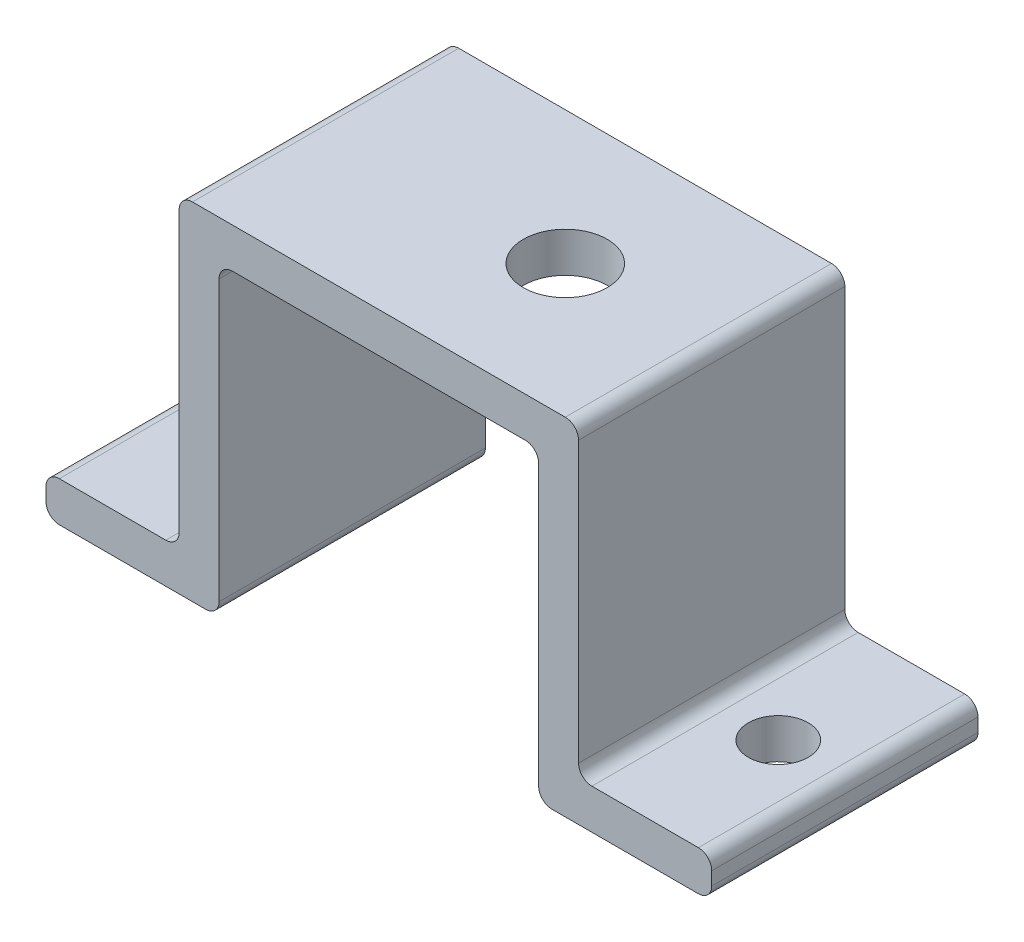
ISO-10303-21;
HEADER;
FILE_DESCRIPTION(('STEP AP214'),'2;1');
FILE_NAME('part.step','',(''),(''),'','','');
FILE_SCHEMA(('AUTOMOTIVE_DESIGN { 1 0 10303 214 1 1 1 1 }'));
ENDSEC;
DATA;
#1=APPLICATION_CONTEXT('core data for automotive mechanical design processes');
#2=APPLICATION_PROTOCOL_DEFINITION('international standard','automotive_design',2000,#1);
#3=PRODUCT_CONTEXT('',#1,'mechanical');
#4=PRODUCT('Part','Part','',(#3));
#5=PRODUCT_RELATED_PRODUCT_CATEGORY('part','',(#4));
#6=PRODUCT_DEFINITION_FORMATION('','',#4);
#7=PRODUCT_DEFINITION_CONTEXT('part definition',#1,'design');
#8=PRODUCT_DEFINITION('design','',#6,#7);
#9=PRODUCT_DEFINITION_SHAPE('','',#8);
#10=(LENGTH_UNIT() NAMED_UNIT(*) SI_UNIT(.MILLI.,.METRE.));
#11=(NAMED_UNIT(*) PLANE_ANGLE_UNIT() SI_UNIT($,.RADIAN.));
#12=(NAMED_UNIT(*) SI_UNIT($,.STERADIAN.) SOLID_ANGLE_UNIT());
#13=UNCERTAINTY_MEASURE_WITH_UNIT(LENGTH_MEASURE(1.E-05),#10,'distance_accuracy_value','');
#14=(GEOMETRIC_REPRESENTATION_CONTEXT(3) GLOBAL_UNCERTAINTY_ASSIGNED_CONTEXT((#13)) GLOBAL_UNIT_ASSIGNED_CONTEXT((#10,
#11,#12)) REPRESENTATION_CONTEXT('',''));
#15=CARTESIAN_POINT('',(0.,0.,0.));
#16=DIRECTION('',(0.,0.,1.));
#17=DIRECTION('',(1.,0.,0.));
#18=AXIS2_PLACEMENT_3D('',#15,#16,#17);
#19=CARTESIAN_POINT('',(15.,-20.,20.));
#20=DIRECTION('',(-1.,0.,0.));
#21=DIRECTION('',(0.,-1.,0.));
#22=AXIS2_PLACEMENT_3D('',#19,#20,#21);
#23=PLANE('',#22);
#24=DIRECTION('',(0.,1.,0.));
#25=VECTOR('',#24,1.);
#26=CARTESIAN_POINT('',(15.,-20.,0.));
#27=LINE('',#26,#25);
#28=CARTESIAN_POINT('',(15.,-19.,0.));
#29=VERTEX_POINT('',#28);
#30=CARTESIAN_POINT('',(15.,2.,0.));
#31=VERTEX_POINT('',#30);
#32=EDGE_CURVE('E234',#29,#31,#27,.T.);
#33=ORIENTED_EDGE('',*,*,#32,.T.);
#34=DIRECTION('',(0.,0.,-1.));
#35=VECTOR('',#34,1.);
#36=CARTESIAN_POINT('',(15.,2.,20.));
#37=LINE('',#36,#35);
#38=CARTESIAN_POINT('',(15.,2.,20.));
#39=VERTEX_POINT('',#38);
#40=EDGE_CURVE('E299',#31,#39,#37,.F.);
#41=ORIENTED_EDGE('',*,*,#40,.T.);
#42=DIRECTION('',(0.,1.,0.));
#43=VECTOR('',#42,1.);
#44=CARTESIAN_POINT('',(15.,-20.,20.));
#45=LINE('',#44,#43);
#46=CARTESIAN_POINT('',(15.,-19.,20.));
#47=VERTEX_POINT('',#46);
#48=EDGE_CURVE('E221',#47,#39,#45,.T.);
#49=ORIENTED_EDGE('',*,*,#48,.F.);
#50=DIRECTION('',(0.,0.,-1.));
#51=VECTOR('',#50,1.);
#52=CARTESIAN_POINT('',(15.,-19.,0.));
#53=LINE('',#52,#51);
#54=EDGE_CURVE('E296',#47,#29,#53,.T.);
#55=ORIENTED_EDGE('',*,*,#54,.T.);
#56=EDGE_LOOP('',(#33,#41,#49,#55));
#57=FACE_BOUND('',#56,.T.);
#58=ADVANCED_FACE('F32',(#57),#23,.F.);
#59=CARTESIAN_POINT('',(-15.,3.,20.));
#60=DIRECTION('',(0.,-1.,0.));
#61=DIRECTION('',(0.,0.,-1.));
#62=AXIS2_PLACEMENT_3D('',#59,#60,#61);
#63=PLANE('',#62);
#64=CARTESIAN_POINT('',(4.,3.,10.));
#65=DIRECTION('',(0.,1.,0.));
#66=DIRECTION('',(-1.,0.,0.));
#67=AXIS2_PLACEMENT_3D('',#64,#65,#66);
#68=CIRCLE('',#67,3.15);
#69=CARTESIAN_POINT('',(0.849999999999999,3.,10.));
#70=VERTEX_POINT('',#69);
#71=EDGE_CURVE('E235',#70,#70,#68,.T.);
#72=ORIENTED_EDGE('',*,*,#71,.F.);
#73=EDGE_LOOP('',(#72));
#74=FACE_BOUND('',#73,.T.);
#75=DIRECTION('',(-1.,0.,0.));
#76=VECTOR('',#75,1.);
#77=CARTESIAN_POINT('',(-15.,3.,0.));
#78=LINE('',#77,#76);
#79=CARTESIAN_POINT('',(14.,3.,0.));
#80=VERTEX_POINT('',#79);
#81=CARTESIAN_POINT('',(-14.,3.,0.));
#82=VERTEX_POINT('',#81);
#83=EDGE_CURVE('E363',#80,#82,#78,.T.);
#84=ORIENTED_EDGE('',*,*,#83,.T.);
#85=DIRECTION('',(0.,0.,-1.));
#86=VECTOR('',#85,1.);
#87=CARTESIAN_POINT('',(-14.,3.,20.));
#88=LINE('',#87,#86);
#89=CARTESIAN_POINT('',(-14.,3.,20.));
#90=VERTEX_POINT('',#89);
#91=EDGE_CURVE('E294',#82,#90,#88,.F.);
#92=ORIENTED_EDGE('',*,*,#91,.T.);
#93=DIRECTION('',(-1.,0.,0.));
#94=VECTOR('',#93,1.);
#95=CARTESIAN_POINT('',(-15.,3.,20.));
#96=LINE('',#95,#94);
#97=CARTESIAN_POINT('',(14.,3.,20.));
#98=VERTEX_POINT('',#97);
#99=EDGE_CURVE('E225',#98,#90,#96,.T.);
#100=ORIENTED_EDGE('',*,*,#99,.F.);
#101=DIRECTION('',(0.,0.,-1.));
#102=VECTOR('',#101,1.);
#103=CARTESIAN_POINT('',(14.,3.,20.));
#104=LINE('',#103,#102);
#105=EDGE_CURVE('E291',#98,#80,#104,.T.);
#106=ORIENTED_EDGE('',*,*,#105,.T.);
#107=EDGE_LOOP('',(#84,#92,#100,#106));
#108=FACE_BOUND('',#107,.T.);
#109=ADVANCED_FACE('F401',(#74,#108),#63,.F.);
#110=CARTESIAN_POINT('',(-15.,-20.,20.));
#111=DIRECTION('',(1.,0.,0.));
#112=DIRECTION('',(0.,1.,0.));
#113=AXIS2_PLACEMENT_3D('',#110,#111,#112);
#114=PLANE('',#113);
#115=DIRECTION('',(0.,-1.,0.));
#116=VECTOR('',#115,1.);
#117=CARTESIAN_POINT('',(-15.,-20.,0.));
#118=LINE('',#117,#116);
#119=CARTESIAN_POINT('',(-15.,2.,0.));
#120=VERTEX_POINT('',#119);
#121=CARTESIAN_POINT('',(-15.,-19.,0.));
#122=VERTEX_POINT('',#121);
#123=EDGE_CURVE('E366',#120,#122,#118,.T.);
#124=ORIENTED_EDGE('',*,*,#123,.T.);
#125=DIRECTION('',(0.,0.,-1.));
#126=VECTOR('',#125,1.);
#127=CARTESIAN_POINT('',(-15.,-19.,20.));
#128=LINE('',#127,#126);
#129=CARTESIAN_POINT('',(-15.,-19.,20.));
#130=VERTEX_POINT('',#129);
#131=EDGE_CURVE('E289',#122,#130,#128,.F.);
#132=ORIENTED_EDGE('',*,*,#131,.T.);
#133=DIRECTION('',(0.,-1.,0.));
#134=VECTOR('',#133,1.);
#135=CARTESIAN_POINT('',(-15.,-20.,20.));
#136=LINE('',#135,#134);
#137=CARTESIAN_POINT('',(-15.,2.,20.));
#138=VERTEX_POINT('',#137);
#139=EDGE_CURVE('E471',#138,#130,#136,.T.);
#140=ORIENTED_EDGE('',*,*,#139,.F.);
#141=DIRECTION('',(0.,0.,-1.));
#142=VECTOR('',#141,1.);
#143=CARTESIAN_POINT('',(-15.,2.,20.));
#144=LINE('',#143,#142);
#145=EDGE_CURVE('E286',#138,#120,#144,.T.);
#146=ORIENTED_EDGE('',*,*,#145,.T.);
#147=EDGE_LOOP('',(#124,#132,#140,#146));
#148=FACE_BOUND('',#147,.T.);
#149=ADVANCED_FACE('F407',(#148),#114,.F.);
#150=CARTESIAN_POINT('',(-15.,-20.,20.));
#151=DIRECTION('',(0.,-1.,0.));
#152=DIRECTION('',(1.,0.,0.));
#153=AXIS2_PLACEMENT_3D('',#150,#151,#152);
#154=PLANE('',#153);
#155=CARTESIAN_POINT('',(-20.,-19.9999999999999,10.));
#156=DIRECTION('',(0.,1.,0.));
#157=DIRECTION('',(-1.,0.,0.));
#158=AXIS2_PLACEMENT_3D('',#155,#156,#157);
#159=CIRCLE('',#158,2.25);
#160=CARTESIAN_POINT('',(-22.25,-19.9999999999999,10.));
#161=VERTEX_POINT('',#160);
#162=EDGE_CURVE('E479',#161,#161,#159,.T.);
#163=ORIENTED_EDGE('',*,*,#162,.F.);
#164=EDGE_LOOP('',(#163));
#165=FACE_BOUND('',#164,.T.);
#166=DIRECTION('',(-1.,0.,0.));
#167=VECTOR('',#166,1.);
#168=CARTESIAN_POINT('',(-15.,-20.,0.));
#169=LINE('',#168,#167);
#170=CARTESIAN_POINT('',(-16.,-20.,0.));
#171=VERTEX_POINT('',#170);
#172=CARTESIAN_POINT('',(-24.,-20.,0.));
#173=VERTEX_POINT('',#172);
#174=EDGE_CURVE('E369',#171,#173,#169,.T.);
#175=ORIENTED_EDGE('',*,*,#174,.T.);
#176=DIRECTION('',(0.,0.,-1.));
#177=VECTOR('',#176,1.);
#178=CARTESIAN_POINT('',(-24.,-20.,20.));
#179=LINE('',#178,#177);
#180=CARTESIAN_POINT('',(-24.,-20.,20.));
#181=VERTEX_POINT('',#180);
#182=EDGE_CURVE('E284',#173,#181,#179,.F.);
#183=ORIENTED_EDGE('',*,*,#182,.T.);
#184=DIRECTION('',(-1.,0.,0.));
#185=VECTOR('',#184,1.);
#186=CARTESIAN_POINT('',(-15.,-20.,20.));
#187=LINE('',#186,#185);
#188=CARTESIAN_POINT('',(-16.,-20.,20.));
#189=VERTEX_POINT('',#188);
#190=EDGE_CURVE('E468',#189,#181,#187,.T.);
#191=ORIENTED_EDGE('',*,*,#190,.F.);
#192=DIRECTION('',(0.,0.,-1.));
#193=VECTOR('',#192,1.);
#194=CARTESIAN_POINT('',(-16.,-20.,0.));
#195=LINE('',#194,#193);
#196=EDGE_CURVE('E281',#189,#171,#195,.T.);
#197=ORIENTED_EDGE('',*,*,#196,.T.);
#198=EDGE_LOOP('',(#175,#183,#191,#197));
#199=FACE_BOUND('',#198,.T.);
#200=ADVANCED_FACE('F546',(#165,#199),#154,.F.);
#201=CARTESIAN_POINT('',(-25.,-20.,20.));
#202=DIRECTION('',(1.,0.,0.));
#203=DIRECTION('',(0.,1.,0.));
#204=AXIS2_PLACEMENT_3D('',#201,#202,#203);
#205=PLANE('',#204);
#206=DIRECTION('',(0.,-1.,0.));
#207=VECTOR('',#206,1.);
#208=CARTESIAN_POINT('',(-25.,-20.,0.));
#209=LINE('',#208,#207);
#210=CARTESIAN_POINT('',(-25.,-21.,0.));
#211=VERTEX_POINT('',#210);
#212=CARTESIAN_POINT('',(-25.,-22.,0.));
#213=VERTEX_POINT('',#212);
#214=EDGE_CURVE('E372',#211,#213,#209,.T.);
#215=ORIENTED_EDGE('',*,*,#214,.T.);
#216=DIRECTION('',(0.,0.,-1.));
#217=VECTOR('',#216,1.);
#218=CARTESIAN_POINT('',(-25.,-22.,20.));
#219=LINE('',#218,#217);
#220=CARTESIAN_POINT('',(-25.,-22.,20.));
#221=VERTEX_POINT('',#220);
#222=EDGE_CURVE('E275',#213,#221,#219,.F.);
#223=ORIENTED_EDGE('',*,*,#222,.T.);
#224=DIRECTION('',(0.,-1.,0.));
#225=VECTOR('',#224,1.);
#226=CARTESIAN_POINT('',(-25.,-20.,20.));
#227=LINE('',#226,#225);
#228=CARTESIAN_POINT('',(-25.,-21.,20.));
#229=VERTEX_POINT('',#228);
#230=EDGE_CURVE('E463',#229,#221,#227,.T.);
#231=ORIENTED_EDGE('',*,*,#230,.F.);
#232=DIRECTION('',(0.,0.,-1.));
#233=VECTOR('',#232,1.);
#234=CARTESIAN_POINT('',(-25.,-21.,20.));
#235=LINE('',#234,#233);
#236=EDGE_CURVE('E272',#229,#211,#235,.T.);
#237=ORIENTED_EDGE('',*,*,#236,.T.);
#238=EDGE_LOOP('',(#215,#223,#231,#237));
#239=FACE_BOUND('',#238,.T.);
#240=ADVANCED_FACE('F555',(#239),#205,.F.);
#241=CARTESIAN_POINT('',(-12.,-23.,20.));
#242=DIRECTION('',(0.,1.,0.));
#243=DIRECTION('',(0.,0.,1.));
#244=AXIS2_PLACEMENT_3D('',#241,#242,#243);
#245=PLANE('',#244);
#246=CARTESIAN_POINT('',(-20.,-23.,10.));
#247=DIRECTION('',(0.,1.,0.));
#248=DIRECTION('',(-1.,0.,0.));
#249=AXIS2_PLACEMENT_3D('',#246,#247,#248);
#250=CIRCLE('',#249,2.25);
#251=CARTESIAN_POINT('',(-22.25,-23.,10.));
#252=VERTEX_POINT('',#251);
#253=EDGE_CURVE('E478',#252,#252,#250,.T.);
#254=ORIENTED_EDGE('',*,*,#253,.T.);
#255=EDGE_LOOP('',(#254));
#256=FACE_BOUND('',#255,.T.);
#257=DIRECTION('',(1.,0.,0.));
#258=VECTOR('',#257,1.);
#259=CARTESIAN_POINT('',(-12.,-23.,20.));
#260=LINE('',#259,#258);
#261=CARTESIAN_POINT('',(-24.,-23.,20.));
#262=VERTEX_POINT('',#261);
#263=CARTESIAN_POINT('',(-13.,-23.,20.));
#264=VERTEX_POINT('',#263);
#265=EDGE_CURVE('E462',#262,#264,#260,.T.);
#266=ORIENTED_EDGE('',*,*,#265,.F.);
#267=DIRECTION('',(0.,0.,-1.));
#268=VECTOR('',#267,1.);
#269=CARTESIAN_POINT('',(-24.,-23.,20.));
#270=LINE('',#269,#268);
#271=CARTESIAN_POINT('',(-24.,-23.,0.));
#272=VERTEX_POINT('',#271);
#273=EDGE_CURVE('E269',#262,#272,#270,.T.);
#274=ORIENTED_EDGE('',*,*,#273,.T.);
#275=DIRECTION('',(1.,0.,0.));
#276=VECTOR('',#275,1.);
#277=CARTESIAN_POINT('',(-12.,-23.,0.));
#278=LINE('',#277,#276);
#279=CARTESIAN_POINT('',(-13.,-23.,0.));
#280=VERTEX_POINT('',#279);
#281=EDGE_CURVE('E375',#272,#280,#278,.T.);
#282=ORIENTED_EDGE('',*,*,#281,.T.);
#283=DIRECTION('',(0.,0.,-1.));
#284=VECTOR('',#283,1.);
#285=CARTESIAN_POINT('',(-13.,-23.,20.));
#286=LINE('',#285,#284);
#287=EDGE_CURVE('E267',#280,#264,#286,.F.);
#288=ORIENTED_EDGE('',*,*,#287,.T.);
#289=EDGE_LOOP('',(#266,#274,#282,#288));
#290=FACE_BOUND('',#289,.T.);
#291=ADVANCED_FACE('F565',(#256,#290),#245,.F.);
#292=CARTESIAN_POINT('',(-12.,0.,20.));
#293=DIRECTION('',(-1.,0.,0.));
#294=DIRECTION('',(0.,-1.,0.));
#295=AXIS2_PLACEMENT_3D('',#292,#293,#294);
#296=PLANE('',#295);
#297=DIRECTION('',(0.,1.,0.));
#298=VECTOR('',#297,1.);
#299=CARTESIAN_POINT('',(-12.,0.,20.));
#300=LINE('',#299,#298);
#301=CARTESIAN_POINT('',(-12.,-22.,20.));
#302=VERTEX_POINT('',#301);
#303=CARTESIAN_POINT('',(-12.,-1.,20.));
#304=VERTEX_POINT('',#303);
#305=EDGE_CURVE('E355',#302,#304,#300,.T.);
#306=ORIENTED_EDGE('',*,*,#305,.F.);
#307=DIRECTION('',(0.,0.,-1.));
#308=VECTOR('',#307,1.);
#309=CARTESIAN_POINT('',(-12.,-22.,20.));
#310=LINE('',#309,#308);
#311=CARTESIAN_POINT('',(-12.,-22.,0.));
#312=VERTEX_POINT('',#311);
#313=EDGE_CURVE('E308',#302,#312,#310,.T.);
#314=ORIENTED_EDGE('',*,*,#313,.T.);
#315=DIRECTION('',(0.,1.,0.));
#316=VECTOR('',#315,1.);
#317=CARTESIAN_POINT('',(-12.,0.,0.));
#318=LINE('',#317,#316);
#319=CARTESIAN_POINT('',(-12.,-1.,0.));
#320=VERTEX_POINT('',#319);
#321=EDGE_CURVE('E340',#312,#320,#318,.T.);
#322=ORIENTED_EDGE('',*,*,#321,.T.);
#323=DIRECTION('',(0.,0.,-1.));
#324=VECTOR('',#323,1.);
#325=CARTESIAN_POINT('',(-12.,-1.,20.));
#326=LINE('',#325,#324);
#327=EDGE_CURVE('E306',#320,#304,#326,.F.);
#328=ORIENTED_EDGE('',*,*,#327,.T.);
#329=EDGE_LOOP('',(#306,#314,#322,#328));
#330=FACE_BOUND('',#329,.T.);
#331=ADVANCED_FACE('F575',(#330),#296,.F.);
#332=CARTESIAN_POINT('',(-12.,0.,20.));
#333=DIRECTION('',(0.,1.,0.));
#334=DIRECTION('',(-1.,0.,0.));
#335=AXIS2_PLACEMENT_3D('',#332,#333,#334);
#336=PLANE('',#335);
#337=CARTESIAN_POINT('',(4.,0.,10.));
#338=DIRECTION('',(0.,1.,0.));
#339=DIRECTION('',(-1.,0.,0.));
#340=AXIS2_PLACEMENT_3D('',#337,#338,#339);
#341=CIRCLE('',#340,3.15);
#342=CARTESIAN_POINT('',(0.85,0.,10.));
#343=VERTEX_POINT('',#342);
#344=EDGE_CURVE('E231',#343,#343,#341,.T.);
#345=ORIENTED_EDGE('',*,*,#344,.T.);
#346=EDGE_LOOP('',(#345));
#347=FACE_BOUND('',#346,.T.);
#348=DIRECTION('',(1.,0.,0.));
#349=VECTOR('',#348,1.);
#350=CARTESIAN_POINT('',(-12.,0.,20.));
#351=LINE('',#350,#349);
#352=CARTESIAN_POINT('',(-11.,0.,20.));
#353=VERTEX_POINT('',#352);
#354=CARTESIAN_POINT('',(11.,0.,20.));
#355=VERTEX_POINT('',#354);
#356=EDGE_CURVE('E347',#353,#355,#351,.T.);
#357=ORIENTED_EDGE('',*,*,#356,.F.);
#358=DIRECTION('',(0.,0.,-1.));
#359=VECTOR('',#358,1.);
#360=CARTESIAN_POINT('',(-11.,0.,0.));
#361=LINE('',#360,#359);
#362=CARTESIAN_POINT('',(-11.,0.,0.));
#363=VERTEX_POINT('',#362);
#364=EDGE_CURVE('E313',#353,#363,#361,.T.);
#365=ORIENTED_EDGE('',*,*,#364,.T.);
#366=DIRECTION('',(1.,0.,0.));
#367=VECTOR('',#366,1.);
#368=CARTESIAN_POINT('',(-12.,0.,0.));
#369=LINE('',#368,#367);
#370=CARTESIAN_POINT('',(11.,0.,0.));
#371=VERTEX_POINT('',#370);
#372=EDGE_CURVE('E329',#363,#371,#369,.T.);
#373=ORIENTED_EDGE('',*,*,#372,.T.);
#374=DIRECTION('',(0.,0.,-1.));
#375=VECTOR('',#374,1.);
#376=CARTESIAN_POINT('',(11.,0.,20.));
#377=LINE('',#376,#375);
#378=EDGE_CURVE('E311',#371,#355,#377,.F.);
#379=ORIENTED_EDGE('',*,*,#378,.T.);
#380=EDGE_LOOP('',(#357,#365,#373,#379));
#381=FACE_BOUND('',#380,.T.);
#382=ADVANCED_FACE('F337',(#347,#381),#336,.F.);
#383=CARTESIAN_POINT('',(12.,0.,20.));
#384=DIRECTION('',(1.,0.,0.));
#385=DIRECTION('',(0.,1.,0.));
#386=AXIS2_PLACEMENT_3D('',#383,#384,#385);
#387=PLANE('',#386);
#388=DIRECTION('',(0.,-1.,0.));
#389=VECTOR('',#388,1.);
#390=CARTESIAN_POINT('',(12.,0.,0.));
#391=LINE('',#390,#389);
#392=CARTESIAN_POINT('',(12.,-1.,0.));
#393=VERTEX_POINT('',#392);
#394=CARTESIAN_POINT('',(12.,-22.,0.));
#395=VERTEX_POINT('',#394);
#396=EDGE_CURVE('E331',#393,#395,#391,.T.);
#397=ORIENTED_EDGE('',*,*,#396,.T.);
#398=DIRECTION('',(0.,0.,-1.));
#399=VECTOR('',#398,1.);
#400=CARTESIAN_POINT('',(12.,-22.,20.));
#401=LINE('',#400,#399);
#402=CARTESIAN_POINT('',(12.,-22.,20.));
#403=VERTEX_POINT('',#402);
#404=EDGE_CURVE('E304',#395,#403,#401,.F.);
#405=ORIENTED_EDGE('',*,*,#404,.T.);
#406=DIRECTION('',(0.,-1.,0.));
#407=VECTOR('',#406,1.);
#408=CARTESIAN_POINT('',(12.,0.,20.));
#409=LINE('',#408,#407);
#410=CARTESIAN_POINT('',(12.,-1.,20.));
#411=VERTEX_POINT('',#410);
#412=EDGE_CURVE('E346',#411,#403,#409,.T.);
#413=ORIENTED_EDGE('',*,*,#412,.F.);
#414=DIRECTION('',(0.,0.,-1.));
#415=VECTOR('',#414,1.);
#416=CARTESIAN_POINT('',(12.,-1.,0.));
#417=LINE('',#416,#415);
#418=EDGE_CURVE('E301',#411,#393,#417,.T.);
#419=ORIENTED_EDGE('',*,*,#418,.T.);
#420=EDGE_LOOP('',(#397,#405,#413,#419));
#421=FACE_BOUND('',#420,.T.);
#422=ADVANCED_FACE('F349',(#421),#387,.F.);
#423=CARTESIAN_POINT('',(12.,-23.,20.));
#424=DIRECTION('',(0.,1.,0.));
#425=DIRECTION('',(-1.,0.,0.));
#426=AXIS2_PLACEMENT_3D('',#423,#424,#425);
#427=PLANE('',#426);
#428=CARTESIAN_POINT('',(20.,-23.0000000000001,10.));
#429=DIRECTION('',(0.,1.,0.));
#430=DIRECTION('',(-1.,0.,0.));
#431=AXIS2_PLACEMENT_3D('',#428,#429,#430);
#432=CIRCLE('',#431,2.25);
#433=CARTESIAN_POINT('',(17.75,-23.0000000000001,10.));
#434=VERTEX_POINT('',#433);
#435=EDGE_CURVE('E482',#434,#434,#432,.T.);
#436=ORIENTED_EDGE('',*,*,#435,.T.);
#437=EDGE_LOOP('',(#436));
#438=FACE_BOUND('',#437,.T.);
#439=DIRECTION('',(1.,0.,0.));
#440=VECTOR('',#439,1.);
#441=CARTESIAN_POINT('',(12.,-23.,0.));
#442=LINE('',#441,#440);
#443=CARTESIAN_POINT('',(13.,-23.,0.));
#444=VERTEX_POINT('',#443);
#445=CARTESIAN_POINT('',(24.,-23.,0.));
#446=VERTEX_POINT('',#445);
#447=EDGE_CURVE('E227',#444,#446,#442,.T.);
#448=ORIENTED_EDGE('',*,*,#447,.T.);
#449=DIRECTION('',(0.,0.,-1.));
#450=VECTOR('',#449,1.);
#451=CARTESIAN_POINT('',(24.,-23.,20.));
#452=LINE('',#451,#450);
#453=CARTESIAN_POINT('',(24.,-23.,20.));
#454=VERTEX_POINT('',#453);
#455=EDGE_CURVE('E47',#446,#454,#452,.F.);
#456=ORIENTED_EDGE('',*,*,#455,.T.);
#457=DIRECTION('',(1.,0.,0.));
#458=VECTOR('',#457,1.);
#459=CARTESIAN_POINT('',(12.,-23.,20.));
#460=LINE('',#459,#458);
#461=CARTESIAN_POINT('',(13.,-23.,20.));
#462=VERTEX_POINT('',#461);
#463=EDGE_CURVE('E351',#462,#454,#460,.T.);
#464=ORIENTED_EDGE('',*,*,#463,.F.);
#465=DIRECTION('',(0.,0.,-1.));
#466=VECTOR('',#465,1.);
#467=CARTESIAN_POINT('',(13.,-23.,20.));
#468=LINE('',#467,#466);
#469=EDGE_CURVE('E277',#462,#444,#468,.T.);
#470=ORIENTED_EDGE('',*,*,#469,.T.);
#471=EDGE_LOOP('',(#448,#456,#464,#470));
#472=FACE_BOUND('',#471,.T.);
#473=ADVANCED_FACE('F381',(#438,#472),#427,.F.);
#474=CARTESIAN_POINT('',(25.,-20.,20.));
#475=DIRECTION('',(-1.,0.,0.));
#476=DIRECTION('',(0.,-1.,0.));
#477=AXIS2_PLACEMENT_3D('',#474,#475,#476);
#478=PLANE('',#477);
#479=DIRECTION('',(0.,1.,0.));
#480=VECTOR('',#479,1.);
#481=CARTESIAN_POINT('',(25.,-20.,0.));
#482=LINE('',#481,#480);
#483=CARTESIAN_POINT('',(25.,-22.,0.));
#484=VERTEX_POINT('',#483);
#485=CARTESIAN_POINT('',(25.,-21.,0.));
#486=VERTEX_POINT('',#485);
#487=EDGE_CURVE('E222',#484,#486,#482,.T.);
#488=ORIENTED_EDGE('',*,*,#487,.T.);
#489=DIRECTION('',(0.,0.,-1.));
#490=VECTOR('',#489,1.);
#491=CARTESIAN_POINT('',(25.,-21.,20.));
#492=LINE('',#491,#490);
#493=CARTESIAN_POINT('',(25.,-21.,20.));
#494=VERTEX_POINT('',#493);
#495=EDGE_CURVE('E199',#486,#494,#492,.F.);
#496=ORIENTED_EDGE('',*,*,#495,.T.);
#497=DIRECTION('',(0.,1.,0.));
#498=VECTOR('',#497,1.);
#499=CARTESIAN_POINT('',(25.,-20.,20.));
#500=LINE('',#499,#498);
#501=CARTESIAN_POINT('',(25.,-22.,20.));
#502=VERTEX_POINT('',#501);
#503=EDGE_CURVE('E353',#502,#494,#500,.T.);
#504=ORIENTED_EDGE('',*,*,#503,.F.);
#505=DIRECTION('',(0.,0.,-1.));
#506=VECTOR('',#505,1.);
#507=CARTESIAN_POINT('',(25.,-22.,20.));
#508=LINE('',#507,#506);
#509=EDGE_CURVE('E204',#502,#484,#508,.T.);
#510=ORIENTED_EDGE('',*,*,#509,.T.);
#511=EDGE_LOOP('',(#488,#496,#504,#510));
#512=FACE_BOUND('',#511,.T.);
#513=ADVANCED_FACE('F389',(#512),#478,.F.);
#514=CARTESIAN_POINT('',(15.,-20.,20.));
#515=DIRECTION('',(0.,-1.,0.));
#516=DIRECTION('',(1.,0.,0.));
#517=AXIS2_PLACEMENT_3D('',#514,#515,#516);
#518=PLANE('',#517);
#519=CARTESIAN_POINT('',(20.,-20.,10.));
#520=DIRECTION('',(0.,1.,0.));
#521=DIRECTION('',(-1.,0.,0.));
#522=AXIS2_PLACEMENT_3D('',#519,#520,#521);
#523=CIRCLE('',#522,2.25);
#524=CARTESIAN_POINT('',(17.75,-20.,10.));
#525=VERTEX_POINT('',#524);
#526=EDGE_CURVE('E485',#525,#525,#523,.T.);
#527=ORIENTED_EDGE('',*,*,#526,.F.);
#528=EDGE_LOOP('',(#527));
#529=FACE_BOUND('',#528,.T.);
#530=DIRECTION('',(-1.,0.,0.));
#531=VECTOR('',#530,1.);
#532=CARTESIAN_POINT('',(15.,-20.,20.));
#533=LINE('',#532,#531);
#534=CARTESIAN_POINT('',(24.,-20.,20.));
#535=VERTEX_POINT('',#534);
#536=CARTESIAN_POINT('',(16.,-20.,20.));
#537=VERTEX_POINT('',#536);
#538=EDGE_CURVE('E214',#535,#537,#533,.T.);
#539=ORIENTED_EDGE('',*,*,#538,.F.);
#540=DIRECTION('',(0.,0.,-1.));
#541=VECTOR('',#540,1.);
#542=CARTESIAN_POINT('',(24.,-20.,20.));
#543=LINE('',#542,#541);
#544=CARTESIAN_POINT('',(24.,-20.,0.));
#545=VERTEX_POINT('',#544);
#546=EDGE_CURVE('E198',#535,#545,#543,.T.);
#547=ORIENTED_EDGE('',*,*,#546,.T.);
#548=DIRECTION('',(-1.,0.,0.));
#549=VECTOR('',#548,1.);
#550=CARTESIAN_POINT('',(15.,-20.,0.));
#551=LINE('',#550,#549);
#552=CARTESIAN_POINT('',(16.,-20.,0.));
#553=VERTEX_POINT('',#552);
#554=EDGE_CURVE('E211',#545,#553,#551,.T.);
#555=ORIENTED_EDGE('',*,*,#554,.T.);
#556=DIRECTION('',(0.,0.,-1.));
#557=VECTOR('',#556,1.);
#558=CARTESIAN_POINT('',(16.,-20.,20.));
#559=LINE('',#558,#557);
#560=EDGE_CURVE('E216',#553,#537,#559,.F.);
#561=ORIENTED_EDGE('',*,*,#560,.T.);
#562=EDGE_LOOP('',(#539,#547,#555,#561));
#563=FACE_BOUND('',#562,.T.);
#564=ADVANCED_FACE('F210',(#529,#563),#518,.F.);
#565=CARTESIAN_POINT('',(0.,0.,20.));
#566=DIRECTION('',(0.,0.,-1.));
#567=DIRECTION('',(-1.,0.,0.));
#568=AXIS2_PLACEMENT_3D('',#565,#566,#567);
#569=PLANE('',#568);
#570=ORIENTED_EDGE('',*,*,#503,.T.);
#571=CARTESIAN_POINT('',(24.,-21.,20.));
#572=DIRECTION('',(0.,0.,-1.));
#573=DIRECTION('',(-1.,0.,0.));
#574=AXIS2_PLACEMENT_3D('',#571,#572,#573);
#575=CIRCLE('',#574,1.);
#576=EDGE_CURVE('E265',#494,#535,#575,.F.);
#577=ORIENTED_EDGE('',*,*,#576,.T.);
#578=ORIENTED_EDGE('',*,*,#538,.T.);
#579=CARTESIAN_POINT('',(16.,-19.,20.));
#580=DIRECTION('',(0.,0.,-1.));
#581=DIRECTION('',(-1.,0.,0.));
#582=AXIS2_PLACEMENT_3D('',#579,#580,#581);
#583=CIRCLE('',#582,1.);
#584=EDGE_CURVE('E321',#537,#47,#583,.T.);
#585=ORIENTED_EDGE('',*,*,#584,.T.);
#586=ORIENTED_EDGE('',*,*,#48,.T.);
#587=CARTESIAN_POINT('',(14.,2.,20.));
#588=DIRECTION('',(0.,0.,-1.));
#589=DIRECTION('',(-1.,0.,0.));
#590=AXIS2_PLACEMENT_3D('',#587,#588,#589);
#591=CIRCLE('',#590,1.);
#592=EDGE_CURVE('E255',#39,#98,#591,.F.);
#593=ORIENTED_EDGE('',*,*,#592,.T.);
#594=ORIENTED_EDGE('',*,*,#99,.T.);
#595=CARTESIAN_POINT('',(-14.,2.,20.));
#596=DIRECTION('',(0.,0.,-1.));
#597=DIRECTION('',(-1.,0.,0.));
#598=AXIS2_PLACEMENT_3D('',#595,#596,#597);
#599=CIRCLE('',#598,1.);
#600=EDGE_CURVE('E257',#90,#138,#599,.F.);
#601=ORIENTED_EDGE('',*,*,#600,.T.);
#602=ORIENTED_EDGE('',*,*,#139,.T.);
#603=CARTESIAN_POINT('',(-16.,-19.,20.));
#604=DIRECTION('',(0.,0.,-1.));
#605=DIRECTION('',(-1.,0.,0.));
#606=AXIS2_PLACEMENT_3D('',#603,#604,#605);
#607=CIRCLE('',#606,1.);
#608=EDGE_CURVE('E318',#130,#189,#607,.T.);
#609=ORIENTED_EDGE('',*,*,#608,.T.);
#610=ORIENTED_EDGE('',*,*,#190,.T.);
#611=CARTESIAN_POINT('',(-24.,-21.,20.));
#612=DIRECTION('',(0.,0.,-1.));
#613=DIRECTION('',(-1.,0.,0.));
#614=AXIS2_PLACEMENT_3D('',#611,#612,#613);
#615=CIRCLE('',#614,1.);
#616=EDGE_CURVE('E259',#181,#229,#615,.F.);
#617=ORIENTED_EDGE('',*,*,#616,.T.);
#618=ORIENTED_EDGE('',*,*,#230,.T.);
#619=CARTESIAN_POINT('',(-24.,-22.,20.));
#620=DIRECTION('',(0.,0.,-1.));
#621=DIRECTION('',(-1.,0.,0.));
#622=AXIS2_PLACEMENT_3D('',#619,#620,#621);
#623=CIRCLE('',#622,1.);
#624=EDGE_CURVE('E263',#221,#262,#623,.F.);
#625=ORIENTED_EDGE('',*,*,#624,.T.);
#626=ORIENTED_EDGE('',*,*,#265,.T.);
#627=CARTESIAN_POINT('',(-13.,-22.,20.));
#628=DIRECTION('',(0.,0.,-1.));
#629=DIRECTION('',(-1.,0.,0.));
#630=AXIS2_PLACEMENT_3D('',#627,#628,#629);
#631=CIRCLE('',#630,1.);
#632=EDGE_CURVE('E252',#264,#302,#631,.F.);
#633=ORIENTED_EDGE('',*,*,#632,.T.);
#634=ORIENTED_EDGE('',*,*,#305,.T.);
#635=CARTESIAN_POINT('',(-11.,-1.,20.));
#636=DIRECTION('',(0.,0.,-1.));
#637=DIRECTION('',(-1.,0.,0.));
#638=AXIS2_PLACEMENT_3D('',#635,#636,#637);
#639=CIRCLE('',#638,1.);
#640=EDGE_CURVE('E325',#304,#353,#639,.T.);
#641=ORIENTED_EDGE('',*,*,#640,.T.);
#642=ORIENTED_EDGE('',*,*,#356,.T.);
#643=CARTESIAN_POINT('',(11.,-1.,20.));
#644=DIRECTION('',(0.,0.,-1.));
#645=DIRECTION('',(-1.,0.,0.));
#646=AXIS2_PLACEMENT_3D('',#643,#644,#645);
#647=CIRCLE('',#646,1.);
#648=EDGE_CURVE('E11',#355,#411,#647,.T.);
#649=ORIENTED_EDGE('',*,*,#648,.T.);
#650=ORIENTED_EDGE('',*,*,#412,.T.);
#651=CARTESIAN_POINT('',(13.,-22.,20.));
#652=DIRECTION('',(0.,0.,-1.));
#653=DIRECTION('',(-1.,0.,0.));
#654=AXIS2_PLACEMENT_3D('',#651,#652,#653);
#655=CIRCLE('',#654,1.);
#656=EDGE_CURVE('E54',#403,#462,#655,.F.);
#657=ORIENTED_EDGE('',*,*,#656,.T.);
#658=ORIENTED_EDGE('',*,*,#463,.T.);
#659=CARTESIAN_POINT('',(24.,-22.,20.));
#660=DIRECTION('',(0.,0.,-1.));
#661=DIRECTION('',(-1.,0.,0.));
#662=AXIS2_PLACEMENT_3D('',#659,#660,#661);
#663=CIRCLE('',#662,1.);
#664=EDGE_CURVE('E261',#454,#502,#663,.F.);
#665=ORIENTED_EDGE('',*,*,#664,.T.);
#666=EDGE_LOOP('',(#570,#577,#578,#585,#586,#593,#594,#601,#602,#609,#610,#617,#618,#625,#626,
#633,#634,#641,#642,#649,#650,#657,#658,#665));
#667=FACE_BOUND('',#666,.T.);
#668=ADVANCED_FACE('F345',(#667),#569,.F.);
#669=CARTESIAN_POINT('',(0.,0.,0.));
#670=DIRECTION('',(0.,0.,-1.));
#671=DIRECTION('',(-1.,0.,0.));
#672=AXIS2_PLACEMENT_3D('',#669,#670,#671);
#673=PLANE('',#672);
#674=ORIENTED_EDGE('',*,*,#554,.F.);
#675=CARTESIAN_POINT('',(24.,-21.,0.));
#676=DIRECTION('',(0.,0.,-1.));
#677=DIRECTION('',(-1.,0.,0.));
#678=AXIS2_PLACEMENT_3D('',#675,#676,#677);
#679=CIRCLE('',#678,1.);
#680=EDGE_CURVE('E194',#545,#486,#679,.T.);
#681=ORIENTED_EDGE('',*,*,#680,.T.);
#682=ORIENTED_EDGE('',*,*,#487,.F.);
#683=CARTESIAN_POINT('',(24.,-22.,0.));
#684=DIRECTION('',(0.,0.,-1.));
#685=DIRECTION('',(-1.,0.,0.));
#686=AXIS2_PLACEMENT_3D('',#683,#684,#685);
#687=CIRCLE('',#686,1.);
#688=EDGE_CURVE('E246',#484,#446,#687,.T.);
#689=ORIENTED_EDGE('',*,*,#688,.T.);
#690=ORIENTED_EDGE('',*,*,#447,.F.);
#691=CARTESIAN_POINT('',(13.,-22.,0.));
#692=DIRECTION('',(0.,0.,-1.));
#693=DIRECTION('',(-1.,0.,0.));
#694=AXIS2_PLACEMENT_3D('',#691,#692,#693);
#695=CIRCLE('',#694,1.);
#696=EDGE_CURVE('E238',#444,#395,#695,.T.);
#697=ORIENTED_EDGE('',*,*,#696,.T.);
#698=ORIENTED_EDGE('',*,*,#396,.F.);
#699=CARTESIAN_POINT('',(11.,-1.,0.));
#700=DIRECTION('',(0.,0.,-1.));
#701=DIRECTION('',(-1.,0.,0.));
#702=AXIS2_PLACEMENT_3D('',#699,#700,#701);
#703=CIRCLE('',#702,1.);
#704=EDGE_CURVE('E40',#393,#371,#703,.F.);
#705=ORIENTED_EDGE('',*,*,#704,.T.);
#706=ORIENTED_EDGE('',*,*,#372,.F.);
#707=CARTESIAN_POINT('',(-11.,-1.,0.));
#708=DIRECTION('',(0.,0.,-1.));
#709=DIRECTION('',(-1.,0.,0.));
#710=AXIS2_PLACEMENT_3D('',#707,#708,#709);
#711=CIRCLE('',#710,1.);
#712=EDGE_CURVE('E323',#363,#320,#711,.F.);
#713=ORIENTED_EDGE('',*,*,#712,.T.);
#714=ORIENTED_EDGE('',*,*,#321,.F.);
#715=CARTESIAN_POINT('',(-13.,-22.,0.));
#716=DIRECTION('',(0.,0.,-1.));
#717=DIRECTION('',(-1.,0.,0.));
#718=AXIS2_PLACEMENT_3D('',#715,#716,#717);
#719=CIRCLE('',#718,1.);
#720=EDGE_CURVE('E215',#312,#280,#719,.T.);
#721=ORIENTED_EDGE('',*,*,#720,.T.);
#722=ORIENTED_EDGE('',*,*,#281,.F.);
#723=CARTESIAN_POINT('',(-24.,-22.,0.));
#724=DIRECTION('',(0.,0.,-1.));
#725=DIRECTION('',(-1.,0.,0.));
#726=AXIS2_PLACEMENT_3D('',#723,#724,#725);
#727=CIRCLE('',#726,1.);
#728=EDGE_CURVE('E205',#272,#213,#727,.T.);
#729=ORIENTED_EDGE('',*,*,#728,.T.);
#730=ORIENTED_EDGE('',*,*,#214,.F.);
#731=CARTESIAN_POINT('',(-24.,-21.,0.));
#732=DIRECTION('',(0.,0.,-1.));
#733=DIRECTION('',(-1.,0.,0.));
#734=AXIS2_PLACEMENT_3D('',#731,#732,#733);
#735=CIRCLE('',#734,1.);
#736=EDGE_CURVE('E244',#211,#173,#735,.T.);
#737=ORIENTED_EDGE('',*,*,#736,.T.);
#738=ORIENTED_EDGE('',*,*,#174,.F.);
#739=CARTESIAN_POINT('',(-16.,-19.,0.));
#740=DIRECTION('',(0.,0.,-1.));
#741=DIRECTION('',(-1.,0.,0.));
#742=AXIS2_PLACEMENT_3D('',#739,#740,#741);
#743=CIRCLE('',#742,1.);
#744=EDGE_CURVE('E316',#171,#122,#743,.F.);
#745=ORIENTED_EDGE('',*,*,#744,.T.);
#746=ORIENTED_EDGE('',*,*,#123,.F.);
#747=CARTESIAN_POINT('',(-14.,2.,0.));
#748=DIRECTION('',(0.,0.,-1.));
#749=DIRECTION('',(-1.,0.,0.));
#750=AXIS2_PLACEMENT_3D('',#747,#748,#749);
#751=CIRCLE('',#750,1.);
#752=EDGE_CURVE('E242',#120,#82,#751,.T.);
#753=ORIENTED_EDGE('',*,*,#752,.T.);
#754=ORIENTED_EDGE('',*,*,#83,.F.);
#755=CARTESIAN_POINT('',(14.,2.,0.));
#756=DIRECTION('',(0.,0.,-1.));
#757=DIRECTION('',(-1.,0.,0.));
#758=AXIS2_PLACEMENT_3D('',#755,#756,#757);
#759=CIRCLE('',#758,1.);
#760=EDGE_CURVE('E240',#80,#31,#759,.T.);
#761=ORIENTED_EDGE('',*,*,#760,.T.);
#762=ORIENTED_EDGE('',*,*,#32,.F.);
#763=CARTESIAN_POINT('',(16.,-19.,0.));
#764=DIRECTION('',(0.,0.,-1.));
#765=DIRECTION('',(-1.,0.,0.));
#766=AXIS2_PLACEMENT_3D('',#763,#764,#765);
#767=CIRCLE('',#766,1.);
#768=EDGE_CURVE('E220',#29,#553,#767,.F.);
#769=ORIENTED_EDGE('',*,*,#768,.T.);
#770=EDGE_LOOP('',(#674,#681,#682,#689,#690,#697,#698,#705,#706,#713,#714,#721,#722,#729,#730,
#737,#738,#745,#746,#753,#754,#761,#762,#769));
#771=FACE_BOUND('',#770,.T.);
#772=ADVANCED_FACE('F218',(#771),#673,.T.);
#773=CARTESIAN_POINT('',(4.,-23.,10.));
#774=DIRECTION('',(0.,1.,0.));
#775=DIRECTION('',(-1.,0.,0.));
#776=AXIS2_PLACEMENT_3D('',#773,#774,#775);
#777=CYLINDRICAL_SURFACE('',#776,3.15);
#778=ORIENTED_EDGE('',*,*,#71,.T.);
#779=EDGE_LOOP('',(#778));
#780=FACE_BOUND('',#779,.T.);
#781=ORIENTED_EDGE('',*,*,#344,.F.);
#782=EDGE_LOOP('',(#781));
#783=FACE_BOUND('',#782,.T.);
#784=ADVANCED_FACE('F499',(#780,#783),#777,.F.);
#785=CARTESIAN_POINT('',(-20.,-23.,10.));
#786=DIRECTION('',(0.,1.,0.));
#787=DIRECTION('',(-1.,0.,0.));
#788=AXIS2_PLACEMENT_3D('',#785,#786,#787);
#789=CYLINDRICAL_SURFACE('',#788,2.25);
#790=ORIENTED_EDGE('',*,*,#253,.F.);
#791=EDGE_LOOP('',(#790));
#792=FACE_BOUND('',#791,.T.);
#793=ORIENTED_EDGE('',*,*,#162,.T.);
#794=EDGE_LOOP('',(#793));
#795=FACE_BOUND('',#794,.T.);
#796=ADVANCED_FACE('F493',(#792,#795),#789,.F.);
#797=CARTESIAN_POINT('',(20.,-23.0000000000001,10.));
#798=DIRECTION('',(0.,1.,0.));
#799=DIRECTION('',(-1.,0.,0.));
#800=AXIS2_PLACEMENT_3D('',#797,#798,#799);
#801=CYLINDRICAL_SURFACE('',#800,2.25);
#802=ORIENTED_EDGE('',*,*,#435,.F.);
#803=EDGE_LOOP('',(#802));
#804=FACE_BOUND('',#803,.T.);
#805=ORIENTED_EDGE('',*,*,#526,.T.);
#806=EDGE_LOOP('',(#805));
#807=FACE_BOUND('',#806,.T.);
#808=ADVANCED_FACE('F415',(#804,#807),#801,.F.);
#809=CARTESIAN_POINT('',(24.,-21.,20.));
#810=DIRECTION('',(0.,0.,-1.));
#811=DIRECTION('',(-1.,0.,0.));
#812=AXIS2_PLACEMENT_3D('',#809,#810,#811);
#813=CYLINDRICAL_SURFACE('',#812,1.);
#814=ORIENTED_EDGE('',*,*,#576,.F.);
#815=ORIENTED_EDGE('',*,*,#495,.F.);
#816=ORIENTED_EDGE('',*,*,#680,.F.);
#817=ORIENTED_EDGE('',*,*,#546,.F.);
#818=EDGE_LOOP('',(#814,#815,#816,#817));
#819=FACE_BOUND('',#818,.T.);
#820=ADVANCED_FACE('F197',(#819),#813,.T.);
#821=CARTESIAN_POINT('',(-24.,-22.,20.));
#822=DIRECTION('',(0.,0.,-1.));
#823=DIRECTION('',(-1.,0.,0.));
#824=AXIS2_PLACEMENT_3D('',#821,#822,#823);
#825=CYLINDRICAL_SURFACE('',#824,1.);
#826=ORIENTED_EDGE('',*,*,#624,.F.);
#827=ORIENTED_EDGE('',*,*,#222,.F.);
#828=ORIENTED_EDGE('',*,*,#728,.F.);
#829=ORIENTED_EDGE('',*,*,#273,.F.);
#830=EDGE_LOOP('',(#826,#827,#828,#829));
#831=FACE_BOUND('',#830,.T.);
#832=ADVANCED_FACE('F414',(#831),#825,.T.);
#833=CARTESIAN_POINT('',(24.,-22.,20.));
#834=DIRECTION('',(0.,0.,-1.));
#835=DIRECTION('',(-1.,0.,0.));
#836=AXIS2_PLACEMENT_3D('',#833,#834,#835);
#837=CYLINDRICAL_SURFACE('',#836,1.);
#838=ORIENTED_EDGE('',*,*,#664,.F.);
#839=ORIENTED_EDGE('',*,*,#455,.F.);
#840=ORIENTED_EDGE('',*,*,#688,.F.);
#841=ORIENTED_EDGE('',*,*,#509,.F.);
#842=EDGE_LOOP('',(#838,#839,#840,#841));
#843=FACE_BOUND('',#842,.T.);
#844=ADVANCED_FACE('F385',(#843),#837,.T.);
#845=CARTESIAN_POINT('',(-24.,-21.,20.));
#846=DIRECTION('',(0.,0.,-1.));
#847=DIRECTION('',(-1.,0.,0.));
#848=AXIS2_PLACEMENT_3D('',#845,#846,#847);
#849=CYLINDRICAL_SURFACE('',#848,1.);
#850=ORIENTED_EDGE('',*,*,#616,.F.);
#851=ORIENTED_EDGE('',*,*,#182,.F.);
#852=ORIENTED_EDGE('',*,*,#736,.F.);
#853=ORIENTED_EDGE('',*,*,#236,.F.);
#854=EDGE_LOOP('',(#850,#851,#852,#853));
#855=FACE_BOUND('',#854,.T.);
#856=ADVANCED_FACE('F421',(#855),#849,.T.);
#857=CARTESIAN_POINT('',(-16.,-19.,20.));
#858=DIRECTION('',(0.,0.,1.));
#859=DIRECTION('',(1.,0.,0.));
#860=AXIS2_PLACEMENT_3D('',#857,#858,#859);
#861=CYLINDRICAL_SURFACE('',#860,1.);
#862=ORIENTED_EDGE('',*,*,#608,.F.);
#863=ORIENTED_EDGE('',*,*,#131,.F.);
#864=ORIENTED_EDGE('',*,*,#744,.F.);
#865=ORIENTED_EDGE('',*,*,#196,.F.);
#866=EDGE_LOOP('',(#862,#863,#864,#865));
#867=FACE_BOUND('',#866,.T.);
#868=ADVANCED_FACE('F424',(#867),#861,.F.);
#869=CARTESIAN_POINT('',(-14.,2.,20.));
#870=DIRECTION('',(0.,0.,-1.));
#871=DIRECTION('',(-1.,0.,0.));
#872=AXIS2_PLACEMENT_3D('',#869,#870,#871);
#873=CYLINDRICAL_SURFACE('',#872,1.);
#874=ORIENTED_EDGE('',*,*,#600,.F.);
#875=ORIENTED_EDGE('',*,*,#91,.F.);
#876=ORIENTED_EDGE('',*,*,#752,.F.);
#877=ORIENTED_EDGE('',*,*,#145,.F.);
#878=EDGE_LOOP('',(#874,#875,#876,#877));
#879=FACE_BOUND('',#878,.T.);
#880=ADVANCED_FACE('F428',(#879),#873,.T.);
#881=CARTESIAN_POINT('',(14.,2.,20.));
#882=DIRECTION('',(0.,0.,-1.));
#883=DIRECTION('',(-1.,0.,0.));
#884=AXIS2_PLACEMENT_3D('',#881,#882,#883);
#885=CYLINDRICAL_SURFACE('',#884,1.);
#886=ORIENTED_EDGE('',*,*,#592,.F.);
#887=ORIENTED_EDGE('',*,*,#40,.F.);
#888=ORIENTED_EDGE('',*,*,#760,.F.);
#889=ORIENTED_EDGE('',*,*,#105,.F.);
#890=EDGE_LOOP('',(#886,#887,#888,#889));
#891=FACE_BOUND('',#890,.T.);
#892=ADVANCED_FACE('F432',(#891),#885,.T.);
#893=CARTESIAN_POINT('',(16.,-19.,20.));
#894=DIRECTION('',(0.,0.,1.));
#895=DIRECTION('',(1.,0.,0.));
#896=AXIS2_PLACEMENT_3D('',#893,#894,#895);
#897=CYLINDRICAL_SURFACE('',#896,1.);
#898=ORIENTED_EDGE('',*,*,#584,.F.);
#899=ORIENTED_EDGE('',*,*,#560,.F.);
#900=ORIENTED_EDGE('',*,*,#768,.F.);
#901=ORIENTED_EDGE('',*,*,#54,.F.);
#902=EDGE_LOOP('',(#898,#899,#900,#901));
#903=FACE_BOUND('',#902,.T.);
#904=ADVANCED_FACE('F436',(#903),#897,.F.);
#905=CARTESIAN_POINT('',(13.,-22.,20.));
#906=DIRECTION('',(0.,0.,-1.));
#907=DIRECTION('',(-1.,0.,0.));
#908=AXIS2_PLACEMENT_3D('',#905,#906,#907);
#909=CYLINDRICAL_SURFACE('',#908,1.);
#910=ORIENTED_EDGE('',*,*,#656,.F.);
#911=ORIENTED_EDGE('',*,*,#404,.F.);
#912=ORIENTED_EDGE('',*,*,#696,.F.);
#913=ORIENTED_EDGE('',*,*,#469,.F.);
#914=EDGE_LOOP('',(#910,#911,#912,#913));
#915=FACE_BOUND('',#914,.T.);
#916=ADVANCED_FACE('F440',(#915),#909,.T.);
#917=CARTESIAN_POINT('',(-13.,-22.,20.));
#918=DIRECTION('',(0.,0.,-1.));
#919=DIRECTION('',(-1.,0.,0.));
#920=AXIS2_PLACEMENT_3D('',#917,#918,#919);
#921=CYLINDRICAL_SURFACE('',#920,1.);
#922=ORIENTED_EDGE('',*,*,#632,.F.);
#923=ORIENTED_EDGE('',*,*,#287,.F.);
#924=ORIENTED_EDGE('',*,*,#720,.F.);
#925=ORIENTED_EDGE('',*,*,#313,.F.);
#926=EDGE_LOOP('',(#922,#923,#924,#925));
#927=FACE_BOUND('',#926,.T.);
#928=ADVANCED_FACE('F444',(#927),#921,.T.);
#929=CARTESIAN_POINT('',(-11.,-1.,20.));
#930=DIRECTION('',(0.,0.,1.));
#931=DIRECTION('',(1.,0.,0.));
#932=AXIS2_PLACEMENT_3D('',#929,#930,#931);
#933=CYLINDRICAL_SURFACE('',#932,1.);
#934=ORIENTED_EDGE('',*,*,#640,.F.);
#935=ORIENTED_EDGE('',*,*,#327,.F.);
#936=ORIENTED_EDGE('',*,*,#712,.F.);
#937=ORIENTED_EDGE('',*,*,#364,.F.);
#938=EDGE_LOOP('',(#934,#935,#936,#937));
#939=FACE_BOUND('',#938,.T.);
#940=ADVANCED_FACE('F447',(#939),#933,.F.);
#941=CARTESIAN_POINT('',(11.,-1.,20.));
#942=DIRECTION('',(0.,0.,1.));
#943=DIRECTION('',(1.,0.,0.));
#944=AXIS2_PLACEMENT_3D('',#941,#942,#943);
#945=CYLINDRICAL_SURFACE('',#944,1.);
#946=ORIENTED_EDGE('',*,*,#648,.F.);
#947=ORIENTED_EDGE('',*,*,#378,.F.);
#948=ORIENTED_EDGE('',*,*,#704,.F.);
#949=ORIENTED_EDGE('',*,*,#418,.F.);
#950=EDGE_LOOP('',(#946,#947,#948,#949));
#951=FACE_BOUND('',#950,.T.);
#952=ADVANCED_FACE('F34',(#951),#945,.F.);
#953=CLOSED_SHELL('',(#58,#109,#149,#200,#240,#291,#331,#382,#422,#473,#513,#564,#668,#772,#784,
#796,#808,#820,#832,#844,#856,#868,#880,#892,#904,#916,#928,#940,#952));
#954=MANIFOLD_SOLID_BREP('B2',#953);
#955=ADVANCED_BREP_SHAPE_REPRESENTATION('',(#18,#954),#14);
#956=SHAPE_DEFINITION_REPRESENTATION(#9,#955);
ENDSEC;
END-ISO-10303-21;
